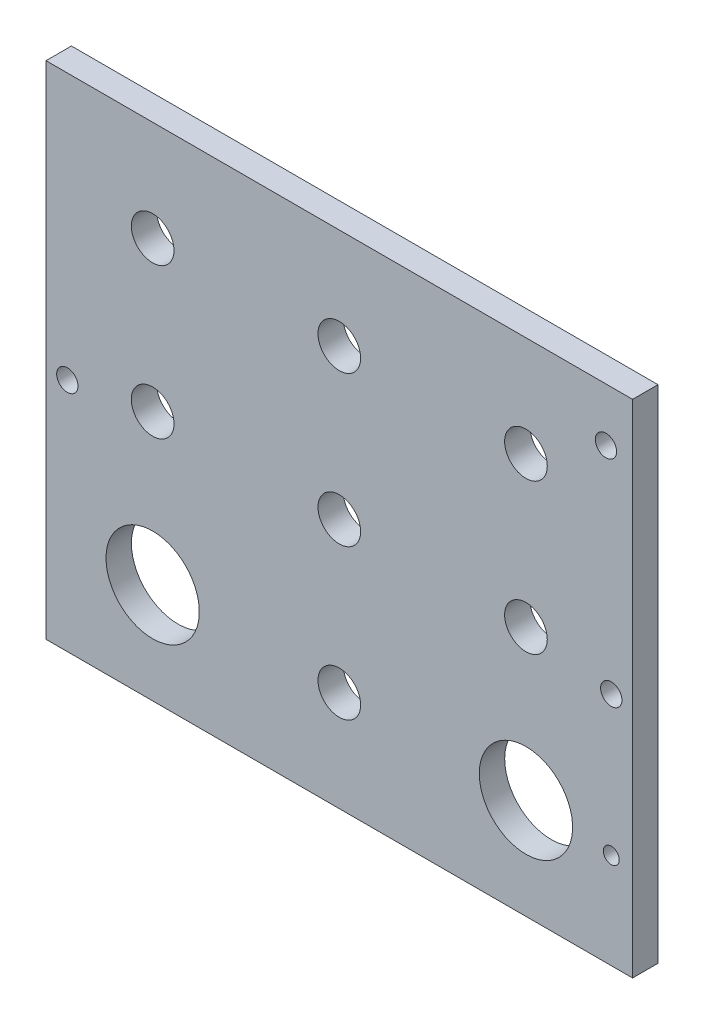
ISO-10303-21;
HEADER;
FILE_DESCRIPTION(('STEP AP214'),'2;1');
FILE_NAME('part.step','',(''),(''),'','','');
FILE_SCHEMA(('AUTOMOTIVE_DESIGN { 1 0 10303 214 1 1 1 1 }'));
ENDSEC;
DATA;
#1=APPLICATION_CONTEXT('core data for automotive mechanical design processes');
#2=APPLICATION_PROTOCOL_DEFINITION('international standard','automotive_design',2000,#1);
#3=PRODUCT_CONTEXT('',#1,'mechanical');
#4=PRODUCT('Part','Part','',(#3));
#5=PRODUCT_RELATED_PRODUCT_CATEGORY('part','',(#4));
#6=PRODUCT_DEFINITION_FORMATION('','',#4);
#7=PRODUCT_DEFINITION_CONTEXT('part definition',#1,'design');
#8=PRODUCT_DEFINITION('design','',#6,#7);
#9=PRODUCT_DEFINITION_SHAPE('','',#8);
#10=(LENGTH_UNIT() NAMED_UNIT(*) SI_UNIT(.MILLI.,.METRE.));
#11=(NAMED_UNIT(*) PLANE_ANGLE_UNIT() SI_UNIT($,.RADIAN.));
#12=(NAMED_UNIT(*) SI_UNIT($,.STERADIAN.) SOLID_ANGLE_UNIT());
#13=UNCERTAINTY_MEASURE_WITH_UNIT(LENGTH_MEASURE(1.E-05),#10,'distance_accuracy_value','');
#14=(GEOMETRIC_REPRESENTATION_CONTEXT(3) GLOBAL_UNCERTAINTY_ASSIGNED_CONTEXT((#13)) GLOBAL_UNIT_ASSIGNED_CONTEXT((#10,
#11,#12)) REPRESENTATION_CONTEXT('',''));
#15=CARTESIAN_POINT('',(0.,0.,0.));
#16=DIRECTION('',(0.,0.,1.));
#17=DIRECTION('',(1.,0.,0.));
#18=AXIS2_PLACEMENT_3D('',#15,#16,#17);
#19=CARTESIAN_POINT('',(0.,0.,0.));
#20=DIRECTION('',(0.,0.,-1.));
#21=DIRECTION('',(-1.,0.,0.));
#22=AXIS2_PLACEMENT_3D('',#19,#20,#21);
#23=PLANE('',#22);
#24=CARTESIAN_POINT('',(96.,35.2204304552847,0.));
#25=DIRECTION('',(0.,0.,-1.));
#26=DIRECTION('',(-1.,0.,0.));
#27=AXIS2_PLACEMENT_3D('',#24,#25,#26);
#28=CIRCLE('',#27,2.);
#29=CARTESIAN_POINT('',(94.,35.2204304552847,0.));
#30=VERTEX_POINT('',#29);
#31=EDGE_CURVE('E178',#30,#30,#28,.T.);
#32=ORIENTED_EDGE('',*,*,#31,.F.);
#33=EDGE_LOOP('',(#32));
#34=FACE_BOUND('',#33,.T.);
#35=CARTESIAN_POINT('',(-6.,35.2204304552848,0.));
#36=DIRECTION('',(0.,0.,-1.));
#37=DIRECTION('',(-1.,0.,0.));
#38=AXIS2_PLACEMENT_3D('',#35,#36,#37);
#39=CIRCLE('',#38,2.0000000000001);
#40=CARTESIAN_POINT('',(-8.0000000000001,35.2204304552848,0.));
#41=VERTEX_POINT('',#40);
#42=EDGE_CURVE('E167',#41,#41,#39,.T.);
#43=ORIENTED_EDGE('',*,*,#42,.F.);
#44=EDGE_LOOP('',(#43));
#45=FACE_BOUND('',#44,.T.);
#46=CARTESIAN_POINT('',(95.999999999984,9.02651671482296,0.));
#47=DIRECTION('',(0.,0.,-1.));
#48=DIRECTION('',(-1.,0.,0.));
#49=AXIS2_PLACEMENT_3D('',#46,#47,#48);
#50=CIRCLE('',#49,1.5);
#51=CARTESIAN_POINT('',(94.499999999984,9.02651671482296,0.));
#52=VERTEX_POINT('',#51);
#53=EDGE_CURVE('E171',#52,#52,#50,.T.);
#54=ORIENTED_EDGE('',*,*,#53,.F.);
#55=EDGE_LOOP('',(#54));
#56=FACE_BOUND('',#55,.T.);
#57=CARTESIAN_POINT('',(94.9999999999996,75.0900000000003,0.));
#58=DIRECTION('',(0.,0.,-1.));
#59=DIRECTION('',(-1.,0.,0.));
#60=AXIS2_PLACEMENT_3D('',#57,#58,#59);
#61=CIRCLE('',#60,2.00000000000001);
#62=CARTESIAN_POINT('',(92.9999999999995,75.0900000000003,0.));
#63=VERTEX_POINT('',#62);
#64=EDGE_CURVE('E163',#63,#63,#61,.T.);
#65=ORIENTED_EDGE('',*,*,#64,.F.);
#66=EDGE_LOOP('',(#65));
#67=FACE_BOUND('',#66,.T.);
#68=CARTESIAN_POINT('',(10.,9.95,0.));
#69=DIRECTION('',(0.,0.,-1.));
#70=DIRECTION('',(-1.,0.,0.));
#71=AXIS2_PLACEMENT_3D('',#68,#69,#70);
#72=CIRCLE('',#71,8.75);
#73=CARTESIAN_POINT('',(1.25,9.95,0.));
#74=VERTEX_POINT('',#73);
#75=EDGE_CURVE('E160',#74,#74,#72,.T.);
#76=ORIENTED_EDGE('',*,*,#75,.F.);
#77=EDGE_LOOP('',(#76));
#78=FACE_BOUND('',#77,.T.);
#79=CARTESIAN_POINT('',(80.,9.95,0.));
#80=DIRECTION('',(0.,0.,-1.));
#81=DIRECTION('',(-1.,0.,0.));
#82=AXIS2_PLACEMENT_3D('',#79,#80,#81);
#83=CIRCLE('',#82,8.75000000000001);
#84=CARTESIAN_POINT('',(71.25,9.95,0.));
#85=VERTEX_POINT('',#84);
#86=EDGE_CURVE('E100',#85,#85,#83,.T.);
#87=ORIENTED_EDGE('',*,*,#86,.F.);
#88=EDGE_LOOP('',(#87));
#89=FACE_BOUND('',#88,.T.);
#90=CARTESIAN_POINT('',(80.,38.1,0.));
#91=DIRECTION('',(0.,0.,1.));
#92=DIRECTION('',(1.,0.,0.));
#93=AXIS2_PLACEMENT_3D('',#90,#91,#92);
#94=CIRCLE('',#93,4.00000000000001);
#95=CARTESIAN_POINT('',(84.,38.1,0.));
#96=VERTEX_POINT('',#95);
#97=EDGE_CURVE('E143',#96,#96,#94,.T.);
#98=ORIENTED_EDGE('',*,*,#97,.T.);
#99=EDGE_LOOP('',(#98));
#100=FACE_BOUND('',#99,.T.);
#101=CARTESIAN_POINT('',(45.,66.25,0.));
#102=DIRECTION('',(0.,0.,1.));
#103=DIRECTION('',(1.,0.,0.));
#104=AXIS2_PLACEMENT_3D('',#101,#102,#103);
#105=CIRCLE('',#104,4.00000000000001);
#106=CARTESIAN_POINT('',(49.,66.25,0.));
#107=VERTEX_POINT('',#106);
#108=EDGE_CURVE('E149',#107,#107,#105,.T.);
#109=ORIENTED_EDGE('',*,*,#108,.T.);
#110=EDGE_LOOP('',(#109));
#111=FACE_BOUND('',#110,.T.);
#112=CARTESIAN_POINT('',(10.,66.25,0.));
#113=DIRECTION('',(0.,0.,1.));
#114=DIRECTION('',(1.,0.,0.));
#115=AXIS2_PLACEMENT_3D('',#112,#113,#114);
#116=CIRCLE('',#115,4.);
#117=CARTESIAN_POINT('',(14.,66.25,0.));
#118=VERTEX_POINT('',#117);
#119=EDGE_CURVE('E152',#118,#118,#116,.T.);
#120=ORIENTED_EDGE('',*,*,#119,.T.);
#121=EDGE_LOOP('',(#120));
#122=FACE_BOUND('',#121,.T.);
#123=DIRECTION('',(-1.,0.,0.));
#124=VECTOR('',#123,1.);
#125=CARTESIAN_POINT('',(95.,85.09,0.));
#126=LINE('',#125,#124);
#127=CARTESIAN_POINT('',(100.,85.09,0.));
#128=VERTEX_POINT('',#127);
#129=CARTESIAN_POINT('',(-10.,85.09,0.));
#130=VERTEX_POINT('',#129);
#131=EDGE_CURVE('E115',#128,#130,#126,.T.);
#132=ORIENTED_EDGE('',*,*,#131,.F.);
#133=DIRECTION('',(0.,1.,0.));
#134=VECTOR('',#133,1.);
#135=CARTESIAN_POINT('',(100.,-8.89,0.));
#136=LINE('',#135,#134);
#137=CARTESIAN_POINT('',(100.,-8.89,0.));
#138=VERTEX_POINT('',#137);
#139=EDGE_CURVE('E83',#138,#128,#136,.T.);
#140=ORIENTED_EDGE('',*,*,#139,.F.);
#141=DIRECTION('',(1.,0.,0.));
#142=VECTOR('',#141,1.);
#143=CARTESIAN_POINT('',(95.,-8.89,0.));
#144=LINE('',#143,#142);
#145=CARTESIAN_POINT('',(-10.,-8.89,0.));
#146=VERTEX_POINT('',#145);
#147=EDGE_CURVE('E51',#146,#138,#144,.T.);
#148=ORIENTED_EDGE('',*,*,#147,.F.);
#149=DIRECTION('',(0.,-1.,0.));
#150=VECTOR('',#149,1.);
#151=CARTESIAN_POINT('',(-10.,-8.89,0.));
#152=LINE('',#151,#150);
#153=EDGE_CURVE('E81',#130,#146,#152,.T.);
#154=ORIENTED_EDGE('',*,*,#153,.F.);
#155=EDGE_LOOP('',(#132,#140,#148,#154));
#156=FACE_BOUND('',#155,.T.);
#157=CARTESIAN_POINT('',(45.,38.1,0.));
#158=DIRECTION('',(0.,0.,1.));
#159=DIRECTION('',(1.,0.,0.));
#160=AXIS2_PLACEMENT_3D('',#157,#158,#159);
#161=CIRCLE('',#160,4.00000000000001);
#162=CARTESIAN_POINT('',(49.,38.1,0.));
#163=VERTEX_POINT('',#162);
#164=EDGE_CURVE('E11',#163,#163,#161,.T.);
#165=ORIENTED_EDGE('',*,*,#164,.T.);
#166=EDGE_LOOP('',(#165));
#167=FACE_BOUND('',#166,.T.);
#168=CARTESIAN_POINT('',(80.,66.25,0.));
#169=DIRECTION('',(0.,0.,1.));
#170=DIRECTION('',(1.,0.,0.));
#171=AXIS2_PLACEMENT_3D('',#168,#169,#170);
#172=CIRCLE('',#171,4.00000000000003);
#173=CARTESIAN_POINT('',(84.,66.25,0.));
#174=VERTEX_POINT('',#173);
#175=EDGE_CURVE('E43',#174,#174,#172,.T.);
#176=ORIENTED_EDGE('',*,*,#175,.T.);
#177=EDGE_LOOP('',(#176));
#178=FACE_BOUND('',#177,.T.);
#179=CARTESIAN_POINT('',(10.,38.1,0.));
#180=DIRECTION('',(0.,0.,1.));
#181=DIRECTION('',(1.,0.,0.));
#182=AXIS2_PLACEMENT_3D('',#179,#180,#181);
#183=CIRCLE('',#182,4.);
#184=CARTESIAN_POINT('',(14.,38.1,0.));
#185=VERTEX_POINT('',#184);
#186=EDGE_CURVE('E146',#185,#185,#183,.T.);
#187=ORIENTED_EDGE('',*,*,#186,.T.);
#188=EDGE_LOOP('',(#187));
#189=FACE_BOUND('',#188,.T.);
#190=CARTESIAN_POINT('',(45.,9.95,0.));
#191=DIRECTION('',(0.,0.,1.));
#192=DIRECTION('',(1.,0.,0.));
#193=AXIS2_PLACEMENT_3D('',#190,#191,#192);
#194=CIRCLE('',#193,4.00000000000001);
#195=CARTESIAN_POINT('',(49.,9.95,0.));
#196=VERTEX_POINT('',#195);
#197=EDGE_CURVE('E140',#196,#196,#194,.T.);
#198=ORIENTED_EDGE('',*,*,#197,.T.);
#199=EDGE_LOOP('',(#198));
#200=FACE_BOUND('',#199,.T.);
#201=ADVANCED_FACE('F35',(#34,#45,#56,#67,#78,#89,#100,#111,#122,#156,#167,#178,#189,#200),#23,.T.);
#202=CARTESIAN_POINT('',(45.,38.1,0.47625));
#203=DIRECTION('',(0.,0.,-1.));
#204=DIRECTION('',(-1.,0.,0.));
#205=AXIS2_PLACEMENT_3D('',#202,#203,#204);
#206=CYLINDRICAL_SURFACE('',#205,4.00000000000001);
#207=ORIENTED_EDGE('',*,*,#164,.F.);
#208=EDGE_LOOP('',(#207));
#209=FACE_BOUND('',#208,.T.);
#210=CARTESIAN_POINT('',(45.,38.1,4.7625));
#211=DIRECTION('',(0.,0.,1.));
#212=DIRECTION('',(1.,0.,0.));
#213=AXIS2_PLACEMENT_3D('',#210,#211,#212);
#214=CIRCLE('',#213,4.00000000000001);
#215=CARTESIAN_POINT('',(49.,38.1,4.7625));
#216=VERTEX_POINT('',#215);
#217=EDGE_CURVE('E137',#216,#216,#214,.T.);
#218=ORIENTED_EDGE('',*,*,#217,.T.);
#219=EDGE_LOOP('',(#218));
#220=FACE_BOUND('',#219,.T.);
#221=ADVANCED_FACE('F192',(#209,#220),#206,.F.);
#222=CARTESIAN_POINT('',(80.,66.25,0.47625));
#223=DIRECTION('',(0.,0.,-1.));
#224=DIRECTION('',(-1.,0.,0.));
#225=AXIS2_PLACEMENT_3D('',#222,#223,#224);
#226=CYLINDRICAL_SURFACE('',#225,4.00000000000003);
#227=ORIENTED_EDGE('',*,*,#175,.F.);
#228=EDGE_LOOP('',(#227));
#229=FACE_BOUND('',#228,.T.);
#230=CARTESIAN_POINT('',(80.,66.25,4.7625));
#231=DIRECTION('',(0.,0.,1.));
#232=DIRECTION('',(1.,0.,0.));
#233=AXIS2_PLACEMENT_3D('',#230,#231,#232);
#234=CIRCLE('',#233,4.00000000000003);
#235=CARTESIAN_POINT('',(84.,66.25,4.7625));
#236=VERTEX_POINT('',#235);
#237=EDGE_CURVE('E134',#236,#236,#234,.T.);
#238=ORIENTED_EDGE('',*,*,#237,.T.);
#239=EDGE_LOOP('',(#238));
#240=FACE_BOUND('',#239,.T.);
#241=ADVANCED_FACE('F207',(#229,#240),#226,.F.);
#242=CARTESIAN_POINT('',(10.,66.25,0.47625));
#243=DIRECTION('',(0.,0.,-1.));
#244=DIRECTION('',(-1.,0.,0.));
#245=AXIS2_PLACEMENT_3D('',#242,#243,#244);
#246=CYLINDRICAL_SURFACE('',#245,4.);
#247=ORIENTED_EDGE('',*,*,#119,.F.);
#248=EDGE_LOOP('',(#247));
#249=FACE_BOUND('',#248,.T.);
#250=CARTESIAN_POINT('',(10.,66.25,4.7625));
#251=DIRECTION('',(0.,0.,1.));
#252=DIRECTION('',(1.,0.,0.));
#253=AXIS2_PLACEMENT_3D('',#250,#251,#252);
#254=CIRCLE('',#253,4.);
#255=CARTESIAN_POINT('',(14.,66.25,4.7625));
#256=VERTEX_POINT('',#255);
#257=EDGE_CURVE('E131',#256,#256,#254,.T.);
#258=ORIENTED_EDGE('',*,*,#257,.T.);
#259=EDGE_LOOP('',(#258));
#260=FACE_BOUND('',#259,.T.);
#261=ADVANCED_FACE('F203',(#249,#260),#246,.F.);
#262=CARTESIAN_POINT('',(45.,66.25,0.47625));
#263=DIRECTION('',(0.,0.,-1.));
#264=DIRECTION('',(-1.,0.,0.));
#265=AXIS2_PLACEMENT_3D('',#262,#263,#264);
#266=CYLINDRICAL_SURFACE('',#265,4.00000000000001);
#267=ORIENTED_EDGE('',*,*,#108,.F.);
#268=EDGE_LOOP('',(#267));
#269=FACE_BOUND('',#268,.T.);
#270=CARTESIAN_POINT('',(45.,66.25,4.7625));
#271=DIRECTION('',(0.,0.,1.));
#272=DIRECTION('',(1.,0.,0.));
#273=AXIS2_PLACEMENT_3D('',#270,#271,#272);
#274=CIRCLE('',#273,4.00000000000001);
#275=CARTESIAN_POINT('',(49.,66.25,4.7625));
#276=VERTEX_POINT('',#275);
#277=EDGE_CURVE('E128',#276,#276,#274,.T.);
#278=ORIENTED_EDGE('',*,*,#277,.T.);
#279=EDGE_LOOP('',(#278));
#280=FACE_BOUND('',#279,.T.);
#281=ADVANCED_FACE('F206',(#269,#280),#266,.F.);
#282=CARTESIAN_POINT('',(10.,38.1,0.47625));
#283=DIRECTION('',(0.,0.,-1.));
#284=DIRECTION('',(-1.,0.,0.));
#285=AXIS2_PLACEMENT_3D('',#282,#283,#284);
#286=CYLINDRICAL_SURFACE('',#285,4.);
#287=ORIENTED_EDGE('',*,*,#186,.F.);
#288=EDGE_LOOP('',(#287));
#289=FACE_BOUND('',#288,.T.);
#290=CARTESIAN_POINT('',(10.,38.1,4.7625));
#291=DIRECTION('',(0.,0.,1.));
#292=DIRECTION('',(1.,0.,0.));
#293=AXIS2_PLACEMENT_3D('',#290,#291,#292);
#294=CIRCLE('',#293,4.);
#295=CARTESIAN_POINT('',(14.,38.1,4.7625));
#296=VERTEX_POINT('',#295);
#297=EDGE_CURVE('E125',#296,#296,#294,.T.);
#298=ORIENTED_EDGE('',*,*,#297,.T.);
#299=EDGE_LOOP('',(#298));
#300=FACE_BOUND('',#299,.T.);
#301=ADVANCED_FACE('F233',(#289,#300),#286,.F.);
#302=CARTESIAN_POINT('',(80.,38.1,0.47625));
#303=DIRECTION('',(0.,0.,-1.));
#304=DIRECTION('',(-1.,0.,0.));
#305=AXIS2_PLACEMENT_3D('',#302,#303,#304);
#306=CYLINDRICAL_SURFACE('',#305,4.00000000000001);
#307=ORIENTED_EDGE('',*,*,#97,.F.);
#308=EDGE_LOOP('',(#307));
#309=FACE_BOUND('',#308,.T.);
#310=CARTESIAN_POINT('',(80.,38.1,4.7625));
#311=DIRECTION('',(0.,0.,1.));
#312=DIRECTION('',(1.,0.,0.));
#313=AXIS2_PLACEMENT_3D('',#310,#311,#312);
#314=CIRCLE('',#313,4.00000000000001);
#315=CARTESIAN_POINT('',(84.,38.1,4.7625));
#316=VERTEX_POINT('',#315);
#317=EDGE_CURVE('E122',#316,#316,#314,.T.);
#318=ORIENTED_EDGE('',*,*,#317,.T.);
#319=EDGE_LOOP('',(#318));
#320=FACE_BOUND('',#319,.T.);
#321=ADVANCED_FACE('F226',(#309,#320),#306,.F.);
#322=CARTESIAN_POINT('',(45.,9.95,0.47625));
#323=DIRECTION('',(0.,0.,-1.));
#324=DIRECTION('',(-1.,0.,0.));
#325=AXIS2_PLACEMENT_3D('',#322,#323,#324);
#326=CYLINDRICAL_SURFACE('',#325,4.00000000000001);
#327=ORIENTED_EDGE('',*,*,#197,.F.);
#328=EDGE_LOOP('',(#327));
#329=FACE_BOUND('',#328,.T.);
#330=CARTESIAN_POINT('',(45.,9.95,4.7625));
#331=DIRECTION('',(0.,0.,1.));
#332=DIRECTION('',(1.,0.,0.));
#333=AXIS2_PLACEMENT_3D('',#330,#331,#332);
#334=CIRCLE('',#333,4.00000000000001);
#335=CARTESIAN_POINT('',(49.,9.95,4.7625));
#336=VERTEX_POINT('',#335);
#337=EDGE_CURVE('E84',#336,#336,#334,.T.);
#338=ORIENTED_EDGE('',*,*,#337,.T.);
#339=EDGE_LOOP('',(#338));
#340=FACE_BOUND('',#339,.T.);
#341=ADVANCED_FACE('F214',(#329,#340),#326,.F.);
#342=CARTESIAN_POINT('',(0.,0.,4.7625));
#343=DIRECTION('',(0.,0.,-1.));
#344=DIRECTION('',(-1.,0.,0.));
#345=AXIS2_PLACEMENT_3D('',#342,#343,#344);
#346=PLANE('',#345);
#347=CARTESIAN_POINT('',(96.,35.2204304552847,4.7625));
#348=DIRECTION('',(0.,0.,-1.));
#349=DIRECTION('',(-1.,0.,0.));
#350=AXIS2_PLACEMENT_3D('',#347,#348,#349);
#351=CIRCLE('',#350,2.);
#352=CARTESIAN_POINT('',(94.,35.2204304552847,4.7625));
#353=VERTEX_POINT('',#352);
#354=EDGE_CURVE('E38',#353,#353,#351,.T.);
#355=ORIENTED_EDGE('',*,*,#354,.T.);
#356=EDGE_LOOP('',(#355));
#357=FACE_BOUND('',#356,.T.);
#358=CARTESIAN_POINT('',(-6.,35.2204304552848,4.7625));
#359=DIRECTION('',(0.,0.,-1.));
#360=DIRECTION('',(-1.,0.,0.));
#361=AXIS2_PLACEMENT_3D('',#358,#359,#360);
#362=CIRCLE('',#361,2.0000000000001);
#363=CARTESIAN_POINT('',(-8.0000000000001,35.2204304552848,4.7625));
#364=VERTEX_POINT('',#363);
#365=EDGE_CURVE('E164',#364,#364,#362,.T.);
#366=ORIENTED_EDGE('',*,*,#365,.T.);
#367=EDGE_LOOP('',(#366));
#368=FACE_BOUND('',#367,.T.);
#369=CARTESIAN_POINT('',(95.999999999984,9.02651671482296,4.7625));
#370=DIRECTION('',(0.,0.,1.));
#371=DIRECTION('',(1.,0.,0.));
#372=AXIS2_PLACEMENT_3D('',#369,#370,#371);
#373=CIRCLE('',#372,1.5);
#374=CARTESIAN_POINT('',(97.499999999984,9.02651671482296,4.7625));
#375=VERTEX_POINT('',#374);
#376=EDGE_CURVE('E166',#375,#375,#373,.T.);
#377=ORIENTED_EDGE('',*,*,#376,.F.);
#378=EDGE_LOOP('',(#377));
#379=FACE_BOUND('',#378,.T.);
#380=CARTESIAN_POINT('',(94.9999999999996,75.0900000000003,4.7625));
#381=DIRECTION('',(0.,0.,-1.));
#382=DIRECTION('',(-1.,0.,0.));
#383=AXIS2_PLACEMENT_3D('',#380,#381,#382);
#384=CIRCLE('',#383,2.00000000000001);
#385=CARTESIAN_POINT('',(92.9999999999995,75.0900000000003,4.7625));
#386=VERTEX_POINT('',#385);
#387=EDGE_CURVE('E161',#386,#386,#384,.T.);
#388=ORIENTED_EDGE('',*,*,#387,.T.);
#389=EDGE_LOOP('',(#388));
#390=FACE_BOUND('',#389,.T.);
#391=CARTESIAN_POINT('',(10.,9.95,4.7625));
#392=DIRECTION('',(0.,0.,-1.));
#393=DIRECTION('',(-1.,0.,0.));
#394=AXIS2_PLACEMENT_3D('',#391,#392,#393);
#395=CIRCLE('',#394,8.75);
#396=CARTESIAN_POINT('',(1.25,9.95,4.7625));
#397=VERTEX_POINT('',#396);
#398=EDGE_CURVE('E157',#397,#397,#395,.T.);
#399=ORIENTED_EDGE('',*,*,#398,.T.);
#400=EDGE_LOOP('',(#399));
#401=FACE_BOUND('',#400,.T.);
#402=CARTESIAN_POINT('',(80.,9.95,4.7625));
#403=DIRECTION('',(0.,0.,-1.));
#404=DIRECTION('',(-1.,0.,0.));
#405=AXIS2_PLACEMENT_3D('',#402,#403,#404);
#406=CIRCLE('',#405,8.75000000000001);
#407=CARTESIAN_POINT('',(71.25,9.95,4.7625));
#408=VERTEX_POINT('',#407);
#409=EDGE_CURVE('E97',#408,#408,#406,.T.);
#410=ORIENTED_EDGE('',*,*,#409,.T.);
#411=EDGE_LOOP('',(#410));
#412=FACE_BOUND('',#411,.T.);
#413=DIRECTION('',(-1.,0.,0.));
#414=VECTOR('',#413,1.);
#415=CARTESIAN_POINT('',(95.,-8.89,4.7625));
#416=LINE('',#415,#414);
#417=CARTESIAN_POINT('',(100.,-8.89,4.7625));
#418=VERTEX_POINT('',#417);
#419=CARTESIAN_POINT('',(-10.,-8.89,4.7625));
#420=VERTEX_POINT('',#419);
#421=EDGE_CURVE('E59',#418,#420,#416,.T.);
#422=ORIENTED_EDGE('',*,*,#421,.F.);
#423=DIRECTION('',(0.,-1.,0.));
#424=VECTOR('',#423,1.);
#425=CARTESIAN_POINT('',(100.,-8.89,4.7625));
#426=LINE('',#425,#424);
#427=CARTESIAN_POINT('',(100.,85.09,4.7625));
#428=VERTEX_POINT('',#427);
#429=EDGE_CURVE('E111',#428,#418,#426,.T.);
#430=ORIENTED_EDGE('',*,*,#429,.F.);
#431=DIRECTION('',(1.,0.,0.));
#432=VECTOR('',#431,1.);
#433=CARTESIAN_POINT('',(95.,85.09,4.7625));
#434=LINE('',#433,#432);
#435=CARTESIAN_POINT('',(-10.,85.09,4.7625));
#436=VERTEX_POINT('',#435);
#437=EDGE_CURVE('E117',#436,#428,#434,.T.);
#438=ORIENTED_EDGE('',*,*,#437,.F.);
#439=DIRECTION('',(0.,1.,0.));
#440=VECTOR('',#439,1.);
#441=CARTESIAN_POINT('',(-10.,-8.89,4.7625));
#442=LINE('',#441,#440);
#443=EDGE_CURVE('E91',#420,#436,#442,.T.);
#444=ORIENTED_EDGE('',*,*,#443,.F.);
#445=EDGE_LOOP('',(#422,#430,#438,#444));
#446=FACE_BOUND('',#445,.T.);
#447=ORIENTED_EDGE('',*,*,#217,.F.);
#448=EDGE_LOOP('',(#447));
#449=FACE_BOUND('',#448,.T.);
#450=ORIENTED_EDGE('',*,*,#237,.F.);
#451=EDGE_LOOP('',(#450));
#452=FACE_BOUND('',#451,.T.);
#453=ORIENTED_EDGE('',*,*,#257,.F.);
#454=EDGE_LOOP('',(#453));
#455=FACE_BOUND('',#454,.T.);
#456=ORIENTED_EDGE('',*,*,#277,.F.);
#457=EDGE_LOOP('',(#456));
#458=FACE_BOUND('',#457,.T.);
#459=ORIENTED_EDGE('',*,*,#297,.F.);
#460=EDGE_LOOP('',(#459));
#461=FACE_BOUND('',#460,.T.);
#462=ORIENTED_EDGE('',*,*,#317,.F.);
#463=EDGE_LOOP('',(#462));
#464=FACE_BOUND('',#463,.T.);
#465=ORIENTED_EDGE('',*,*,#337,.F.);
#466=EDGE_LOOP('',(#465));
#467=FACE_BOUND('',#466,.T.);
#468=ADVANCED_FACE('F211',(#357,#368,#379,#390,#401,#412,#446,#449,#452,#455,#458,#461,#464,
#467),#346,.F.);
#469=CARTESIAN_POINT('',(0.,-8.89,0.));
#470=DIRECTION('',(0.,-1.,0.));
#471=DIRECTION('',(0.,0.,-1.));
#472=AXIS2_PLACEMENT_3D('',#469,#470,#471);
#473=PLANE('',#472);
#474=ORIENTED_EDGE('',*,*,#147,.T.);
#475=DIRECTION('',(0.,0.,-1.));
#476=VECTOR('',#475,1.);
#477=CARTESIAN_POINT('',(100.,-8.89,0.));
#478=LINE('',#477,#476);
#479=EDGE_CURVE('E113',#418,#138,#478,.T.);
#480=ORIENTED_EDGE('',*,*,#479,.F.);
#481=ORIENTED_EDGE('',*,*,#421,.T.);
#482=DIRECTION('',(0.,0.,1.));
#483=VECTOR('',#482,1.);
#484=CARTESIAN_POINT('',(-10.,-8.89,0.));
#485=LINE('',#484,#483);
#486=EDGE_CURVE('E87',#146,#420,#485,.T.);
#487=ORIENTED_EDGE('',*,*,#486,.F.);
#488=EDGE_LOOP('',(#474,#480,#481,#487));
#489=FACE_BOUND('',#488,.T.);
#490=ADVANCED_FACE('F88',(#489),#473,.T.);
#491=CARTESIAN_POINT('',(0.,85.09,0.));
#492=DIRECTION('',(0.,-1.,0.));
#493=DIRECTION('',(0.,0.,-1.));
#494=AXIS2_PLACEMENT_3D('',#491,#492,#493);
#495=PLANE('',#494);
#496=ORIENTED_EDGE('',*,*,#437,.T.);
#497=DIRECTION('',(0.,0.,1.));
#498=VECTOR('',#497,1.);
#499=CARTESIAN_POINT('',(100.,85.09,0.));
#500=LINE('',#499,#498);
#501=EDGE_CURVE('E108',#128,#428,#500,.T.);
#502=ORIENTED_EDGE('',*,*,#501,.F.);
#503=ORIENTED_EDGE('',*,*,#131,.T.);
#504=DIRECTION('',(0.,0.,-1.));
#505=VECTOR('',#504,1.);
#506=CARTESIAN_POINT('',(-10.,85.09,0.));
#507=LINE('',#506,#505);
#508=EDGE_CURVE('E96',#436,#130,#507,.T.);
#509=ORIENTED_EDGE('',*,*,#508,.F.);
#510=EDGE_LOOP('',(#496,#502,#503,#509));
#511=FACE_BOUND('',#510,.T.);
#512=ADVANCED_FACE('F304',(#511),#495,.F.);
#513=CARTESIAN_POINT('',(100.,0.,0.));
#514=DIRECTION('',(1.,0.,0.));
#515=DIRECTION('',(0.,0.,-1.));
#516=AXIS2_PLACEMENT_3D('',#513,#514,#515);
#517=PLANE('',#516);
#518=ORIENTED_EDGE('',*,*,#139,.T.);
#519=ORIENTED_EDGE('',*,*,#501,.T.);
#520=ORIENTED_EDGE('',*,*,#429,.T.);
#521=ORIENTED_EDGE('',*,*,#479,.T.);
#522=EDGE_LOOP('',(#518,#519,#520,#521));
#523=FACE_BOUND('',#522,.T.);
#524=ADVANCED_FACE('F299',(#523),#517,.T.);
#525=CARTESIAN_POINT('',(-10.,0.,0.));
#526=DIRECTION('',(1.,0.,0.));
#527=DIRECTION('',(0.,0.,-1.));
#528=AXIS2_PLACEMENT_3D('',#525,#526,#527);
#529=PLANE('',#528);
#530=ORIENTED_EDGE('',*,*,#153,.T.);
#531=ORIENTED_EDGE('',*,*,#486,.T.);
#532=ORIENTED_EDGE('',*,*,#443,.T.);
#533=ORIENTED_EDGE('',*,*,#508,.T.);
#534=EDGE_LOOP('',(#530,#531,#532,#533));
#535=FACE_BOUND('',#534,.T.);
#536=ADVANCED_FACE('F94',(#535),#529,.F.);
#537=CARTESIAN_POINT('',(80.,9.95,10.));
#538=DIRECTION('',(0.,0.,-1.));
#539=DIRECTION('',(-1.,0.,0.));
#540=AXIS2_PLACEMENT_3D('',#537,#538,#539);
#541=CYLINDRICAL_SURFACE('',#540,8.75000000000001);
#542=ORIENTED_EDGE('',*,*,#86,.T.);
#543=EDGE_LOOP('',(#542));
#544=FACE_BOUND('',#543,.T.);
#545=ORIENTED_EDGE('',*,*,#409,.F.);
#546=EDGE_LOOP('',(#545));
#547=FACE_BOUND('',#546,.T.);
#548=ADVANCED_FACE('F333',(#544,#547),#541,.F.);
#549=CARTESIAN_POINT('',(10.,9.95,10.));
#550=DIRECTION('',(0.,0.,-1.));
#551=DIRECTION('',(-1.,0.,0.));
#552=AXIS2_PLACEMENT_3D('',#549,#550,#551);
#553=CYLINDRICAL_SURFACE('',#552,8.75);
#554=ORIENTED_EDGE('',*,*,#75,.T.);
#555=EDGE_LOOP('',(#554));
#556=FACE_BOUND('',#555,.T.);
#557=ORIENTED_EDGE('',*,*,#398,.F.);
#558=EDGE_LOOP('',(#557));
#559=FACE_BOUND('',#558,.T.);
#560=ADVANCED_FACE('F187',(#556,#559),#553,.F.);
#561=CARTESIAN_POINT('',(94.9999999999996,75.0900000000003,10.));
#562=DIRECTION('',(0.,0.,-1.));
#563=DIRECTION('',(-1.,0.,0.));
#564=AXIS2_PLACEMENT_3D('',#561,#562,#563);
#565=CYLINDRICAL_SURFACE('',#564,2.00000000000001);
#566=ORIENTED_EDGE('',*,*,#64,.T.);
#567=EDGE_LOOP('',(#566));
#568=FACE_BOUND('',#567,.T.);
#569=ORIENTED_EDGE('',*,*,#387,.F.);
#570=EDGE_LOOP('',(#569));
#571=FACE_BOUND('',#570,.T.);
#572=ADVANCED_FACE('F351',(#568,#571),#565,.F.);
#573=CARTESIAN_POINT('',(95.999999999984,9.02651671482296,-5.2375));
#574=DIRECTION('',(0.,0.,1.));
#575=DIRECTION('',(1.,0.,0.));
#576=AXIS2_PLACEMENT_3D('',#573,#574,#575);
#577=CYLINDRICAL_SURFACE('',#576,1.5);
#578=ORIENTED_EDGE('',*,*,#53,.T.);
#579=EDGE_LOOP('',(#578));
#580=FACE_BOUND('',#579,.T.);
#581=ORIENTED_EDGE('',*,*,#376,.T.);
#582=EDGE_LOOP('',(#581));
#583=FACE_BOUND('',#582,.T.);
#584=ADVANCED_FACE('F360',(#580,#583),#577,.F.);
#585=CARTESIAN_POINT('',(-6.,35.2204304552848,10.));
#586=DIRECTION('',(0.,0.,-1.));
#587=DIRECTION('',(-1.,0.,0.));
#588=AXIS2_PLACEMENT_3D('',#585,#586,#587);
#589=CYLINDRICAL_SURFACE('',#588,2.0000000000001);
#590=ORIENTED_EDGE('',*,*,#42,.T.);
#591=EDGE_LOOP('',(#590));
#592=FACE_BOUND('',#591,.T.);
#593=ORIENTED_EDGE('',*,*,#365,.F.);
#594=EDGE_LOOP('',(#593));
#595=FACE_BOUND('',#594,.T.);
#596=ADVANCED_FACE('F369',(#592,#595),#589,.F.);
#597=CARTESIAN_POINT('',(96.,35.2204304552847,10.));
#598=DIRECTION('',(0.,0.,-1.));
#599=DIRECTION('',(-1.,0.,0.));
#600=AXIS2_PLACEMENT_3D('',#597,#598,#599);
#601=CYLINDRICAL_SURFACE('',#600,2.);
#602=ORIENTED_EDGE('',*,*,#31,.T.);
#603=EDGE_LOOP('',(#602));
#604=FACE_BOUND('',#603,.T.);
#605=ORIENTED_EDGE('',*,*,#354,.F.);
#606=EDGE_LOOP('',(#605));
#607=FACE_BOUND('',#606,.T.);
#608=ADVANCED_FACE('F383',(#604,#607),#601,.F.);
#609=CLOSED_SHELL('',(#201,#221,#241,#261,#281,#301,#321,#341,#468,#490,#512,#524,#536,#548,
#560,#572,#584,#596,#608));
#610=MANIFOLD_SOLID_BREP('B2',#609);
#611=ADVANCED_BREP_SHAPE_REPRESENTATION('',(#18,#610),#14);
#612=SHAPE_DEFINITION_REPRESENTATION(#9,#611);
ENDSEC;
END-ISO-10303-21;
